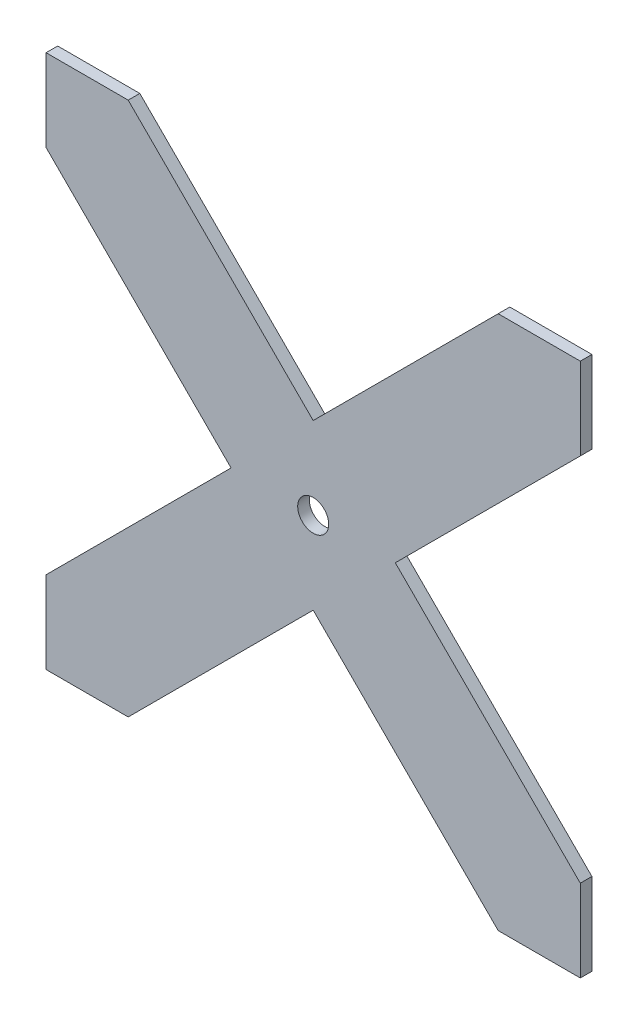
ISO-10303-21;
HEADER;
FILE_DESCRIPTION(('STEP AP214'),'2;1');
FILE_NAME('part.step','',(''),(''),'','','');
FILE_SCHEMA(('AUTOMOTIVE_DESIGN { 1 0 10303 214 1 1 1 1 }'));
ENDSEC;
DATA;
#1=APPLICATION_CONTEXT('core data for automotive mechanical design processes');
#2=APPLICATION_PROTOCOL_DEFINITION('international standard','automotive_design',2000,#1);
#3=PRODUCT_CONTEXT('',#1,'mechanical');
#4=PRODUCT('Part','Part','',(#3));
#5=PRODUCT_RELATED_PRODUCT_CATEGORY('part','',(#4));
#6=PRODUCT_DEFINITION_FORMATION('','',#4);
#7=PRODUCT_DEFINITION_CONTEXT('part definition',#1,'design');
#8=PRODUCT_DEFINITION('design','',#6,#7);
#9=PRODUCT_DEFINITION_SHAPE('','',#8);
#10=(LENGTH_UNIT() NAMED_UNIT(*) SI_UNIT(.MILLI.,.METRE.));
#11=(NAMED_UNIT(*) PLANE_ANGLE_UNIT() SI_UNIT($,.RADIAN.));
#12=(NAMED_UNIT(*) SI_UNIT($,.STERADIAN.) SOLID_ANGLE_UNIT());
#13=UNCERTAINTY_MEASURE_WITH_UNIT(LENGTH_MEASURE(1.E-05),#10,'distance_accuracy_value','');
#14=(GEOMETRIC_REPRESENTATION_CONTEXT(3) GLOBAL_UNCERTAINTY_ASSIGNED_CONTEXT((#13)) GLOBAL_UNIT_ASSIGNED_CONTEXT((#10,
#11,#12)) REPRESENTATION_CONTEXT('',''));
#15=CARTESIAN_POINT('',(0.,0.,0.));
#16=DIRECTION('',(0.,0.,1.));
#17=DIRECTION('',(1.,0.,0.));
#18=AXIS2_PLACEMENT_3D('',#15,#16,#17);
#19=CARTESIAN_POINT('',(17.0245602604753,-7.88294072519122,3.));
#20=DIRECTION('',(0.707106781186545,0.707106781186549,0.));
#21=DIRECTION('',(-0.70710678118655,0.707106781186545,0.));
#22=AXIS2_PLACEMENT_3D('',#19,#20,#21);
#23=PLANE('',#22);
#24=DIRECTION('',(0.,0.,1.));
#25=VECTOR('',#24,1.);
#26=CARTESIAN_POINT('',(-30.7622363039291,39.9038558392129,3.));
#27=LINE('',#26,#25);
#28=CARTESIAN_POINT('',(-30.7622363039291,39.9038558392129,0.));
#29=VERTEX_POINT('',#28);
#30=CARTESIAN_POINT('',(-30.7622363039291,39.9038558392129,3.));
#31=VERTEX_POINT('',#30);
#32=EDGE_CURVE('E163',#29,#31,#27,.T.);
#33=ORIENTED_EDGE('',*,*,#32,.F.);
#34=DIRECTION('',(0.70710678118655,-0.707106781186545,0.));
#35=VECTOR('',#34,1.);
#36=CARTESIAN_POINT('',(17.0245602604753,-7.88294072519122,0.));
#37=LINE('',#36,#35);
#38=CARTESIAN_POINT('',(17.0245602604753,-7.88294072519122,0.));
#39=VERTEX_POINT('',#38);
#40=EDGE_CURVE('E233',#29,#39,#37,.T.);
#41=ORIENTED_EDGE('',*,*,#40,.T.);
#42=DIRECTION('',(0.,0.,-1.));
#43=VECTOR('',#42,1.);
#44=CARTESIAN_POINT('',(17.0245602604753,-7.88294072519122,3.));
#45=LINE('',#44,#43);
#46=CARTESIAN_POINT('',(17.0245602604753,-7.88294072519122,3.));
#47=VERTEX_POINT('',#46);
#48=EDGE_CURVE('E257',#47,#39,#45,.T.);
#49=ORIENTED_EDGE('',*,*,#48,.F.);
#50=DIRECTION('',(0.70710678118655,-0.707106781186545,0.));
#51=VECTOR('',#50,1.);
#52=CARTESIAN_POINT('',(17.0245602604753,-7.88294072519122,3.));
#53=LINE('',#52,#51);
#54=EDGE_CURVE('E213',#31,#47,#53,.T.);
#55=ORIENTED_EDGE('',*,*,#54,.F.);
#56=EDGE_LOOP('',(#33,#41,#49,#55));
#57=FACE_BOUND('',#56,.T.);
#58=ADVANCED_FACE('F38',(#57),#23,.F.);
#59=DIRECTION('',(0.,0.,-1.));
#60=VECTOR('',#59,1.);
#61=CARTESIAN_POINT('',(-51.9754397395256,61.1170592748093,3.));
#62=LINE('',#61,#60);
#63=CARTESIAN_POINT('',(-51.9754397395256,61.1170592748093,3.));
#64=VERTEX_POINT('',#63);
#65=CARTESIAN_POINT('',(-51.9754397395256,61.1170592748093,0.));
#66=VERTEX_POINT('',#65);
#67=EDGE_CURVE('E190',#64,#66,#62,.T.);
#68=ORIENTED_EDGE('',*,*,#67,.F.);
#69=CARTESIAN_POINT('',(-99.7622363039289,108.903855839212,3.));
#70=VERTEX_POINT('',#69);
#71=EDGE_CURVE('E214',#70,#64,#53,.T.);
#72=ORIENTED_EDGE('',*,*,#71,.F.);
#73=DIRECTION('',(0.,0.,-1.));
#74=VECTOR('',#73,1.);
#75=CARTESIAN_POINT('',(-99.7622363039289,108.903855839212,3.));
#76=LINE('',#75,#74);
#77=CARTESIAN_POINT('',(-99.7622363039289,108.903855839212,0.));
#78=VERTEX_POINT('',#77);
#79=EDGE_CURVE('E47',#70,#78,#76,.T.);
#80=ORIENTED_EDGE('',*,*,#79,.T.);
#81=EDGE_CURVE('E234',#78,#66,#37,.T.);
#82=ORIENTED_EDGE('',*,*,#81,.T.);
#83=EDGE_LOOP('',(#68,#72,#80,#82));
#84=FACE_BOUND('',#83,.T.);
#85=ADVANCED_FACE('F266',(#84),#23,.F.);
#86=CARTESIAN_POINT('',(-78.5490328683317,130.117059274808,3.));
#87=DIRECTION('',(-0.707106781186546,-0.707106781186549,0.));
#88=DIRECTION('',(0.707106781186549,-0.707106781186546,0.));
#89=AXIS2_PLACEMENT_3D('',#86,#87,#88);
#90=PLANE('',#89);
#91=DIRECTION('',(0.,0.,-1.));
#92=VECTOR('',#91,1.);
#93=CARTESIAN_POINT('',(-9.54903286833246,61.1170592748091,3.));
#94=LINE('',#93,#92);
#95=CARTESIAN_POINT('',(-9.54903286833245,61.1170592748092,3.));
#96=VERTEX_POINT('',#95);
#97=CARTESIAN_POINT('',(-9.54903286833245,61.1170592748092,0.));
#98=VERTEX_POINT('',#97);
#99=EDGE_CURVE('E62',#96,#98,#94,.T.);
#100=ORIENTED_EDGE('',*,*,#99,.F.);
#101=DIRECTION('',(-0.707106781186549,0.707106781186546,0.));
#102=VECTOR('',#101,1.);
#103=CARTESIAN_POINT('',(-78.5490328683317,130.117059274808,3.));
#104=LINE('',#103,#102);
#105=CARTESIAN_POINT('',(38.2377636960709,13.330262710406,3.));
#106=VERTEX_POINT('',#105);
#107=EDGE_CURVE('E223',#106,#96,#104,.T.);
#108=ORIENTED_EDGE('',*,*,#107,.F.);
#109=DIRECTION('',(0.,0.,-1.));
#110=VECTOR('',#109,1.);
#111=CARTESIAN_POINT('',(38.2377636960709,13.330262710406,3.));
#112=LINE('',#111,#110);
#113=CARTESIAN_POINT('',(38.2377636960709,13.330262710406,0.));
#114=VERTEX_POINT('',#113);
#115=EDGE_CURVE('E249',#106,#114,#112,.T.);
#116=ORIENTED_EDGE('',*,*,#115,.T.);
#117=DIRECTION('',(-0.707106781186549,0.707106781186546,0.));
#118=VECTOR('',#117,1.);
#119=CARTESIAN_POINT('',(-78.5490328683317,130.117059274808,0.));
#120=LINE('',#119,#118);
#121=EDGE_CURVE('E210',#114,#98,#120,.T.);
#122=ORIENTED_EDGE('',*,*,#121,.T.);
#123=EDGE_LOOP('',(#100,#108,#116,#122));
#124=FACE_BOUND('',#123,.T.);
#125=ADVANCED_FACE('F355',(#124),#90,.F.);
#126=DIRECTION('',(0.,0.,1.));
#127=VECTOR('',#126,1.);
#128=CARTESIAN_POINT('',(-30.7622363039289,82.3302627104055,3.));
#129=LINE('',#128,#127);
#130=CARTESIAN_POINT('',(-30.762236303929,82.3302627104055,0.));
#131=VERTEX_POINT('',#130);
#132=CARTESIAN_POINT('',(-30.7622363039289,82.3302627104055,3.));
#133=VERTEX_POINT('',#132);
#134=EDGE_CURVE('E185',#131,#133,#129,.T.);
#135=ORIENTED_EDGE('',*,*,#134,.F.);
#136=CARTESIAN_POINT('',(-78.5490328683317,130.117059274808,0.));
#137=VERTEX_POINT('',#136);
#138=EDGE_CURVE('E243',#131,#137,#120,.T.);
#139=ORIENTED_EDGE('',*,*,#138,.T.);
#140=DIRECTION('',(0.,0.,-1.));
#141=VECTOR('',#140,1.);
#142=CARTESIAN_POINT('',(-78.5490328683317,130.117059274808,3.));
#143=LINE('',#142,#141);
#144=CARTESIAN_POINT('',(-78.5490328683317,130.117059274808,3.));
#145=VERTEX_POINT('',#144);
#146=EDGE_CURVE('E226',#145,#137,#143,.T.);
#147=ORIENTED_EDGE('',*,*,#146,.F.);
#148=EDGE_CURVE('E54',#133,#145,#104,.T.);
#149=ORIENTED_EDGE('',*,*,#148,.F.);
#150=EDGE_LOOP('',(#135,#139,#147,#149));
#151=FACE_BOUND('',#150,.T.);
#152=ADVANCED_FACE('F372',(#151),#90,.F.);
#153=CARTESIAN_POINT('',(-78.5490328683317,130.117059274808,3.));
#154=DIRECTION('',(0.,-1.,0.));
#155=DIRECTION('',(1.,0.,0.));
#156=AXIS2_PLACEMENT_3D('',#153,#154,#155);
#157=PLANE('',#156);
#158=DIRECTION('',(-1.,0.,0.));
#159=VECTOR('',#158,1.);
#160=CARTESIAN_POINT('',(-78.5490328683317,130.117059274808,0.));
#161=LINE('',#160,#159);
#162=CARTESIAN_POINT('',(-99.7622363039289,130.117059274808,0.));
#163=VERTEX_POINT('',#162);
#164=EDGE_CURVE('E204',#137,#163,#161,.T.);
#165=ORIENTED_EDGE('',*,*,#164,.T.);
#166=DIRECTION('',(0.,0.,-1.));
#167=VECTOR('',#166,1.);
#168=CARTESIAN_POINT('',(-99.7622363039289,130.117059274808,3.));
#169=LINE('',#168,#167);
#170=CARTESIAN_POINT('',(-99.7622363039289,130.117059274808,3.));
#171=VERTEX_POINT('',#170);
#172=EDGE_CURVE('E11',#171,#163,#169,.T.);
#173=ORIENTED_EDGE('',*,*,#172,.F.);
#174=DIRECTION('',(-1.,0.,0.));
#175=VECTOR('',#174,1.);
#176=CARTESIAN_POINT('',(-78.5490328683317,130.117059274808,3.));
#177=LINE('',#176,#175);
#178=EDGE_CURVE('E205',#145,#171,#177,.T.);
#179=ORIENTED_EDGE('',*,*,#178,.F.);
#180=ORIENTED_EDGE('',*,*,#146,.T.);
#181=EDGE_LOOP('',(#165,#173,#179,#180));
#182=FACE_BOUND('',#181,.T.);
#183=ADVANCED_FACE('F40',(#182),#157,.F.);
#184=CARTESIAN_POINT('',(-99.7622363039289,130.117059274808,3.));
#185=DIRECTION('',(1.,0.,0.));
#186=DIRECTION('',(0.,0.,-1.));
#187=AXIS2_PLACEMENT_3D('',#184,#185,#186);
#188=PLANE('',#187);
#189=DIRECTION('',(0.,-1.,0.));
#190=VECTOR('',#189,1.);
#191=CARTESIAN_POINT('',(-99.7622363039289,130.117059274808,0.));
#192=LINE('',#191,#190);
#193=EDGE_CURVE('E230',#163,#78,#192,.T.);
#194=ORIENTED_EDGE('',*,*,#193,.T.);
#195=ORIENTED_EDGE('',*,*,#79,.F.);
#196=DIRECTION('',(0.,-1.,0.));
#197=VECTOR('',#196,1.);
#198=CARTESIAN_POINT('',(-99.7622363039289,130.117059274808,3.));
#199=LINE('',#198,#197);
#200=EDGE_CURVE('E209',#171,#70,#199,.T.);
#201=ORIENTED_EDGE('',*,*,#200,.F.);
#202=ORIENTED_EDGE('',*,*,#172,.T.);
#203=EDGE_LOOP('',(#194,#195,#201,#202));
#204=FACE_BOUND('',#203,.T.);
#205=ADVANCED_FACE('F374',(#204),#188,.F.);
#206=CARTESIAN_POINT('',(17.0245602604753,-7.88294072519122,3.));
#207=DIRECTION('',(0.,1.,0.));
#208=DIRECTION('',(-1.,0.,0.));
#209=AXIS2_PLACEMENT_3D('',#206,#207,#208);
#210=PLANE('',#209);
#211=DIRECTION('',(1.,0.,0.));
#212=VECTOR('',#211,1.);
#213=CARTESIAN_POINT('',(17.0245602604753,-7.88294072519122,0.));
#214=LINE('',#213,#212);
#215=CARTESIAN_POINT('',(38.2377636960709,-7.88294072518953,0.));
#216=VERTEX_POINT('',#215);
#217=EDGE_CURVE('E237',#39,#216,#214,.T.);
#218=ORIENTED_EDGE('',*,*,#217,.T.);
#219=DIRECTION('',(0.,0.,-1.));
#220=VECTOR('',#219,1.);
#221=CARTESIAN_POINT('',(38.2377636960709,-7.88294072518953,3.));
#222=LINE('',#221,#220);
#223=CARTESIAN_POINT('',(38.2377636960709,-7.88294072518953,3.));
#224=VERTEX_POINT('',#223);
#225=EDGE_CURVE('E253',#224,#216,#222,.T.);
#226=ORIENTED_EDGE('',*,*,#225,.F.);
#227=DIRECTION('',(1.,0.,0.));
#228=VECTOR('',#227,1.);
#229=CARTESIAN_POINT('',(17.0245602604753,-7.88294072519122,3.));
#230=LINE('',#229,#228);
#231=EDGE_CURVE('E217',#47,#224,#230,.T.);
#232=ORIENTED_EDGE('',*,*,#231,.F.);
#233=ORIENTED_EDGE('',*,*,#48,.T.);
#234=EDGE_LOOP('',(#218,#226,#232,#233));
#235=FACE_BOUND('',#234,.T.);
#236=ADVANCED_FACE('F363',(#235),#210,.F.);
#237=CARTESIAN_POINT('',(38.2377636960709,-7.88294072518953,3.));
#238=DIRECTION('',(-1.,0.,0.));
#239=DIRECTION('',(0.,0.,1.));
#240=AXIS2_PLACEMENT_3D('',#237,#238,#239);
#241=PLANE('',#240);
#242=DIRECTION('',(0.,1.,0.));
#243=VECTOR('',#242,1.);
#244=CARTESIAN_POINT('',(38.2377636960709,-7.88294072518953,0.));
#245=LINE('',#244,#243);
#246=EDGE_CURVE('E240',#216,#114,#245,.T.);
#247=ORIENTED_EDGE('',*,*,#246,.T.);
#248=ORIENTED_EDGE('',*,*,#115,.F.);
#249=DIRECTION('',(0.,1.,0.));
#250=VECTOR('',#249,1.);
#251=CARTESIAN_POINT('',(38.2377636960709,-7.88294072518953,3.));
#252=LINE('',#251,#250);
#253=EDGE_CURVE('E220',#224,#106,#252,.T.);
#254=ORIENTED_EDGE('',*,*,#253,.F.);
#255=ORIENTED_EDGE('',*,*,#225,.T.);
#256=EDGE_LOOP('',(#247,#248,#254,#255));
#257=FACE_BOUND('',#256,.T.);
#258=ADVANCED_FACE('F359',(#257),#241,.F.);
#259=CARTESIAN_POINT('',(0.,0.,3.));
#260=DIRECTION('',(0.,0.,1.));
#261=DIRECTION('',(1.,0.,0.));
#262=AXIS2_PLACEMENT_3D('',#259,#260,#261);
#263=PLANE('',#262);
#264=CARTESIAN_POINT('',(-30.762236303929,61.1170592748092,3.));
#265=DIRECTION('',(0.,0.,1.));
#266=DIRECTION('',(1.,0.,0.));
#267=AXIS2_PLACEMENT_3D('',#264,#265,#266);
#268=CIRCLE('',#267,4.);
#269=CARTESIAN_POINT('',(-26.762236303929,61.1170592748092,3.));
#270=VERTEX_POINT('',#269);
#271=EDGE_CURVE('E330',#270,#270,#268,.T.);
#272=ORIENTED_EDGE('',*,*,#271,.F.);
#273=EDGE_LOOP('',(#272));
#274=FACE_BOUND('',#273,.T.);
#275=ORIENTED_EDGE('',*,*,#71,.T.);
#276=DIRECTION('',(-0.707106781186554,-0.707106781186541,0.));
#277=VECTOR('',#276,1.);
#278=CARTESIAN_POINT('',(17.0245602604744,130.117059274808,3.));
#279=LINE('',#278,#277);
#280=CARTESIAN_POINT('',(-99.7622363039289,13.3302627104069,3.));
#281=VERTEX_POINT('',#280);
#282=EDGE_CURVE('E319',#64,#281,#279,.T.);
#283=ORIENTED_EDGE('',*,*,#282,.T.);
#284=DIRECTION('',(0.,-1.,0.));
#285=VECTOR('',#284,1.);
#286=CARTESIAN_POINT('',(-99.7622363039289,-7.88294072518953,3.));
#287=LINE('',#286,#285);
#288=CARTESIAN_POINT('',(-99.7622363039289,-7.88294072518953,3.));
#289=VERTEX_POINT('',#288);
#290=EDGE_CURVE('E174',#281,#289,#287,.T.);
#291=ORIENTED_EDGE('',*,*,#290,.T.);
#292=DIRECTION('',(1.,0.,0.));
#293=VECTOR('',#292,1.);
#294=CARTESIAN_POINT('',(-78.5490328683324,-7.88294072518953,3.));
#295=LINE('',#294,#293);
#296=CARTESIAN_POINT('',(-78.5490328683324,-7.88294072518953,3.));
#297=VERTEX_POINT('',#296);
#298=EDGE_CURVE('E170',#289,#297,#295,.T.);
#299=ORIENTED_EDGE('',*,*,#298,.T.);
#300=DIRECTION('',(0.707106781186554,0.707106781186541,0.));
#301=VECTOR('',#300,1.);
#302=CARTESIAN_POINT('',(-78.5490328683324,-7.88294072518953,3.));
#303=LINE('',#302,#301);
#304=EDGE_CURVE('E155',#297,#31,#303,.T.);
#305=ORIENTED_EDGE('',*,*,#304,.T.);
#306=ORIENTED_EDGE('',*,*,#54,.T.);
#307=ORIENTED_EDGE('',*,*,#231,.T.);
#308=ORIENTED_EDGE('',*,*,#253,.T.);
#309=ORIENTED_EDGE('',*,*,#107,.T.);
#310=CARTESIAN_POINT('',(38.2377636960709,108.903855839212,3.));
#311=VERTEX_POINT('',#310);
#312=EDGE_CURVE('E167',#96,#311,#303,.T.);
#313=ORIENTED_EDGE('',*,*,#312,.T.);
#314=DIRECTION('',(0.,1.,0.));
#315=VECTOR('',#314,1.);
#316=CARTESIAN_POINT('',(38.2377636960709,130.117059274808,3.));
#317=LINE('',#316,#315);
#318=CARTESIAN_POINT('',(38.2377636960709,130.117059274808,3.));
#319=VERTEX_POINT('',#318);
#320=EDGE_CURVE('E166',#311,#319,#317,.T.);
#321=ORIENTED_EDGE('',*,*,#320,.T.);
#322=DIRECTION('',(-1.,0.,0.));
#323=VECTOR('',#322,1.);
#324=CARTESIAN_POINT('',(17.0245602604744,130.117059274808,3.));
#325=LINE('',#324,#323);
#326=CARTESIAN_POINT('',(17.0245602604744,130.117059274808,3.));
#327=VERTEX_POINT('',#326);
#328=EDGE_CURVE('E307',#319,#327,#325,.T.);
#329=ORIENTED_EDGE('',*,*,#328,.T.);
#330=EDGE_CURVE('E317',#327,#133,#279,.T.);
#331=ORIENTED_EDGE('',*,*,#330,.T.);
#332=ORIENTED_EDGE('',*,*,#148,.T.);
#333=ORIENTED_EDGE('',*,*,#178,.T.);
#334=ORIENTED_EDGE('',*,*,#200,.T.);
#335=EDGE_LOOP('',(#275,#283,#291,#299,#305,#306,#307,#308,#309,#313,#321,#329,#331,#332,#333,#334));
#336=FACE_BOUND('',#335,.T.);
#337=ADVANCED_FACE('F172',(#274,#336),#263,.T.);
#338=CARTESIAN_POINT('',(0.,0.,0.));
#339=DIRECTION('',(0.,0.,1.));
#340=DIRECTION('',(1.,0.,0.));
#341=AXIS2_PLACEMENT_3D('',#338,#339,#340);
#342=PLANE('',#341);
#343=CARTESIAN_POINT('',(-30.762236303929,61.1170592748092,0.));
#344=DIRECTION('',(0.,0.,1.));
#345=DIRECTION('',(1.,0.,0.));
#346=AXIS2_PLACEMENT_3D('',#343,#344,#345);
#347=CIRCLE('',#346,4.);
#348=CARTESIAN_POINT('',(-26.762236303929,61.1170592748092,0.));
#349=VERTEX_POINT('',#348);
#350=EDGE_CURVE('E344',#349,#349,#347,.T.);
#351=ORIENTED_EDGE('',*,*,#350,.T.);
#352=EDGE_LOOP('',(#351));
#353=FACE_BOUND('',#352,.T.);
#354=ORIENTED_EDGE('',*,*,#138,.F.);
#355=DIRECTION('',(-0.707106781186554,-0.707106781186541,0.));
#356=VECTOR('',#355,1.);
#357=CARTESIAN_POINT('',(17.0245602604744,130.117059274808,0.));
#358=LINE('',#357,#356);
#359=CARTESIAN_POINT('',(17.0245602604744,130.117059274808,0.));
#360=VERTEX_POINT('',#359);
#361=EDGE_CURVE('E278',#360,#131,#358,.T.);
#362=ORIENTED_EDGE('',*,*,#361,.F.);
#363=DIRECTION('',(-1.,0.,0.));
#364=VECTOR('',#363,1.);
#365=CARTESIAN_POINT('',(17.0245602604744,130.117059274808,0.));
#366=LINE('',#365,#364);
#367=CARTESIAN_POINT('',(38.2377636960709,130.117059274808,0.));
#368=VERTEX_POINT('',#367);
#369=EDGE_CURVE('E279',#368,#360,#366,.T.);
#370=ORIENTED_EDGE('',*,*,#369,.F.);
#371=DIRECTION('',(0.,1.,0.));
#372=VECTOR('',#371,1.);
#373=CARTESIAN_POINT('',(38.2377636960709,130.117059274808,0.));
#374=LINE('',#373,#372);
#375=CARTESIAN_POINT('',(38.2377636960709,108.903855839212,0.));
#376=VERTEX_POINT('',#375);
#377=EDGE_CURVE('E284',#376,#368,#374,.T.);
#378=ORIENTED_EDGE('',*,*,#377,.F.);
#379=DIRECTION('',(0.707106781186554,0.707106781186541,0.));
#380=VECTOR('',#379,1.);
#381=CARTESIAN_POINT('',(-78.5490328683324,-7.88294072518953,0.));
#382=LINE('',#381,#380);
#383=EDGE_CURVE('E329',#98,#376,#382,.T.);
#384=ORIENTED_EDGE('',*,*,#383,.F.);
#385=ORIENTED_EDGE('',*,*,#121,.F.);
#386=ORIENTED_EDGE('',*,*,#246,.F.);
#387=ORIENTED_EDGE('',*,*,#217,.F.);
#388=ORIENTED_EDGE('',*,*,#40,.F.);
#389=CARTESIAN_POINT('',(-78.5490328683324,-7.88294072518953,0.));
#390=VERTEX_POINT('',#389);
#391=EDGE_CURVE('E331',#390,#29,#382,.T.);
#392=ORIENTED_EDGE('',*,*,#391,.F.);
#393=DIRECTION('',(1.,0.,0.));
#394=VECTOR('',#393,1.);
#395=CARTESIAN_POINT('',(-78.5490328683324,-7.88294072518953,0.));
#396=LINE('',#395,#394);
#397=CARTESIAN_POINT('',(-99.7622363039289,-7.88294072518953,0.));
#398=VERTEX_POINT('',#397);
#399=EDGE_CURVE('E183',#398,#390,#396,.T.);
#400=ORIENTED_EDGE('',*,*,#399,.F.);
#401=DIRECTION('',(0.,-1.,0.));
#402=VECTOR('',#401,1.);
#403=CARTESIAN_POINT('',(-99.7622363039289,-7.88294072518953,0.));
#404=LINE('',#403,#402);
#405=CARTESIAN_POINT('',(-99.7622363039289,13.3302627104069,0.));
#406=VERTEX_POINT('',#405);
#407=EDGE_CURVE('E179',#406,#398,#404,.T.);
#408=ORIENTED_EDGE('',*,*,#407,.F.);
#409=EDGE_CURVE('E273',#66,#406,#358,.T.);
#410=ORIENTED_EDGE('',*,*,#409,.F.);
#411=ORIENTED_EDGE('',*,*,#81,.F.);
#412=ORIENTED_EDGE('',*,*,#193,.F.);
#413=ORIENTED_EDGE('',*,*,#164,.F.);
#414=EDGE_LOOP('',(#354,#362,#370,#378,#384,#385,#386,#387,#388,#392,#400,#408,#410,#411,#412,#413));
#415=FACE_BOUND('',#414,.T.);
#416=ADVANCED_FACE('F270',(#353,#415),#342,.F.);
#417=CARTESIAN_POINT('',(38.2377636960709,130.117059274808,3.));
#418=DIRECTION('',(-1.,0.,0.));
#419=DIRECTION('',(0.,0.,1.));
#420=AXIS2_PLACEMENT_3D('',#417,#418,#419);
#421=PLANE('',#420);
#422=ORIENTED_EDGE('',*,*,#377,.T.);
#423=DIRECTION('',(0.,0.,-1.));
#424=VECTOR('',#423,1.);
#425=CARTESIAN_POINT('',(38.2377636960709,130.117059274808,3.));
#426=LINE('',#425,#424);
#427=EDGE_CURVE('E193',#319,#368,#426,.T.);
#428=ORIENTED_EDGE('',*,*,#427,.F.);
#429=ORIENTED_EDGE('',*,*,#320,.F.);
#430=DIRECTION('',(0.,0.,-1.));
#431=VECTOR('',#430,1.);
#432=CARTESIAN_POINT('',(38.2377636960709,108.903855839212,3.));
#433=LINE('',#432,#431);
#434=EDGE_CURVE('E186',#311,#376,#433,.T.);
#435=ORIENTED_EDGE('',*,*,#434,.T.);
#436=EDGE_LOOP('',(#422,#428,#429,#435));
#437=FACE_BOUND('',#436,.T.);
#438=ADVANCED_FACE('F334',(#437),#421,.F.);
#439=CARTESIAN_POINT('',(17.0245602604744,130.117059274808,3.));
#440=DIRECTION('',(0.,-1.,0.));
#441=DIRECTION('',(0.,0.,-1.));
#442=AXIS2_PLACEMENT_3D('',#439,#440,#441);
#443=PLANE('',#442);
#444=ORIENTED_EDGE('',*,*,#369,.T.);
#445=DIRECTION('',(0.,0.,-1.));
#446=VECTOR('',#445,1.);
#447=CARTESIAN_POINT('',(17.0245602604744,130.117059274808,3.));
#448=LINE('',#447,#446);
#449=EDGE_CURVE('E296',#327,#360,#448,.T.);
#450=ORIENTED_EDGE('',*,*,#449,.F.);
#451=ORIENTED_EDGE('',*,*,#328,.F.);
#452=ORIENTED_EDGE('',*,*,#427,.T.);
#453=EDGE_LOOP('',(#444,#450,#451,#452));
#454=FACE_BOUND('',#453,.T.);
#455=ADVANCED_FACE('F305',(#454),#443,.F.);
#456=CARTESIAN_POINT('',(17.0245602604744,130.117059274808,3.));
#457=DIRECTION('',(0.707106781186541,-0.707106781186554,0.));
#458=DIRECTION('',(0.707106781186554,0.707106781186541,0.));
#459=AXIS2_PLACEMENT_3D('',#456,#457,#458);
#460=PLANE('',#459);
#461=ORIENTED_EDGE('',*,*,#361,.T.);
#462=ORIENTED_EDGE('',*,*,#134,.T.);
#463=ORIENTED_EDGE('',*,*,#330,.F.);
#464=ORIENTED_EDGE('',*,*,#449,.T.);
#465=EDGE_LOOP('',(#461,#462,#463,#464));
#466=FACE_BOUND('',#465,.T.);
#467=ADVANCED_FACE('F314',(#466),#460,.F.);
#468=CARTESIAN_POINT('',(-78.5490328683324,-7.88294072518953,3.));
#469=DIRECTION('',(-0.707106781186541,0.707106781186554,0.));
#470=DIRECTION('',(-0.707106781186554,-0.707106781186541,0.));
#471=AXIS2_PLACEMENT_3D('',#468,#469,#470);
#472=PLANE('',#471);
#473=ORIENTED_EDGE('',*,*,#312,.F.);
#474=ORIENTED_EDGE('',*,*,#99,.T.);
#475=ORIENTED_EDGE('',*,*,#383,.T.);
#476=ORIENTED_EDGE('',*,*,#434,.F.);
#477=EDGE_LOOP('',(#473,#474,#475,#476));
#478=FACE_BOUND('',#477,.T.);
#479=ADVANCED_FACE('F338',(#478),#472,.F.);
#480=ORIENTED_EDGE('',*,*,#391,.T.);
#481=ORIENTED_EDGE('',*,*,#32,.T.);
#482=ORIENTED_EDGE('',*,*,#304,.F.);
#483=DIRECTION('',(0.,0.,-1.));
#484=VECTOR('',#483,1.);
#485=CARTESIAN_POINT('',(-78.5490328683324,-7.88294072518953,3.));
#486=LINE('',#485,#484);
#487=EDGE_CURVE('E160',#297,#390,#486,.T.);
#488=ORIENTED_EDGE('',*,*,#487,.T.);
#489=EDGE_LOOP('',(#480,#481,#482,#488));
#490=FACE_BOUND('',#489,.T.);
#491=ADVANCED_FACE('F158',(#490),#472,.F.);
#492=ORIENTED_EDGE('',*,*,#282,.F.);
#493=ORIENTED_EDGE('',*,*,#67,.T.);
#494=ORIENTED_EDGE('',*,*,#409,.T.);
#495=DIRECTION('',(0.,0.,-1.));
#496=VECTOR('',#495,1.);
#497=CARTESIAN_POINT('',(-99.7622363039289,13.3302627104069,3.));
#498=LINE('',#497,#496);
#499=EDGE_CURVE('E293',#281,#406,#498,.T.);
#500=ORIENTED_EDGE('',*,*,#499,.F.);
#501=EDGE_LOOP('',(#492,#493,#494,#500));
#502=FACE_BOUND('',#501,.T.);
#503=ADVANCED_FACE('F376',(#502),#460,.F.);
#504=CARTESIAN_POINT('',(-78.5490328683324,-7.88294072518953,3.));
#505=DIRECTION('',(0.,1.,0.));
#506=DIRECTION('',(0.,0.,1.));
#507=AXIS2_PLACEMENT_3D('',#504,#505,#506);
#508=PLANE('',#507);
#509=ORIENTED_EDGE('',*,*,#399,.T.);
#510=ORIENTED_EDGE('',*,*,#487,.F.);
#511=ORIENTED_EDGE('',*,*,#298,.F.);
#512=DIRECTION('',(0.,0.,-1.));
#513=VECTOR('',#512,1.);
#514=CARTESIAN_POINT('',(-99.7622363039289,-7.88294072518953,3.));
#515=LINE('',#514,#513);
#516=EDGE_CURVE('E290',#289,#398,#515,.T.);
#517=ORIENTED_EDGE('',*,*,#516,.T.);
#518=EDGE_LOOP('',(#509,#510,#511,#517));
#519=FACE_BOUND('',#518,.T.);
#520=ADVANCED_FACE('F181',(#519),#508,.F.);
#521=CARTESIAN_POINT('',(-99.7622363039289,-7.88294072518953,3.));
#522=DIRECTION('',(1.,0.,0.));
#523=DIRECTION('',(0.,0.,-1.));
#524=AXIS2_PLACEMENT_3D('',#521,#522,#523);
#525=PLANE('',#524);
#526=ORIENTED_EDGE('',*,*,#407,.T.);
#527=ORIENTED_EDGE('',*,*,#516,.F.);
#528=ORIENTED_EDGE('',*,*,#290,.F.);
#529=ORIENTED_EDGE('',*,*,#499,.T.);
#530=EDGE_LOOP('',(#526,#527,#528,#529));
#531=FACE_BOUND('',#530,.T.);
#532=ADVANCED_FACE('F378',(#531),#525,.F.);
#533=CARTESIAN_POINT('',(-30.762236303929,61.1170592748092,0.));
#534=DIRECTION('',(0.,0.,1.));
#535=DIRECTION('',(1.,0.,0.));
#536=AXIS2_PLACEMENT_3D('',#533,#534,#535);
#537=CYLINDRICAL_SURFACE('',#536,4.);
#538=ORIENTED_EDGE('',*,*,#271,.T.);
#539=EDGE_LOOP('',(#538));
#540=FACE_BOUND('',#539,.T.);
#541=ORIENTED_EDGE('',*,*,#350,.F.);
#542=EDGE_LOOP('',(#541));
#543=FACE_BOUND('',#542,.T.);
#544=ADVANCED_FACE('F380',(#540,#543),#537,.F.);
#545=CLOSED_SHELL('',(#58,#85,#125,#152,#183,#205,#236,#258,#337,#416,#438,#455,#467,#479,#491,
#503,#520,#532,#544));
#546=MANIFOLD_SOLID_BREP('B2',#545);
#547=ADVANCED_BREP_SHAPE_REPRESENTATION('',(#18,#546),#14);
#548=SHAPE_DEFINITION_REPRESENTATION(#9,#547);
ENDSEC;
END-ISO-10303-21;
